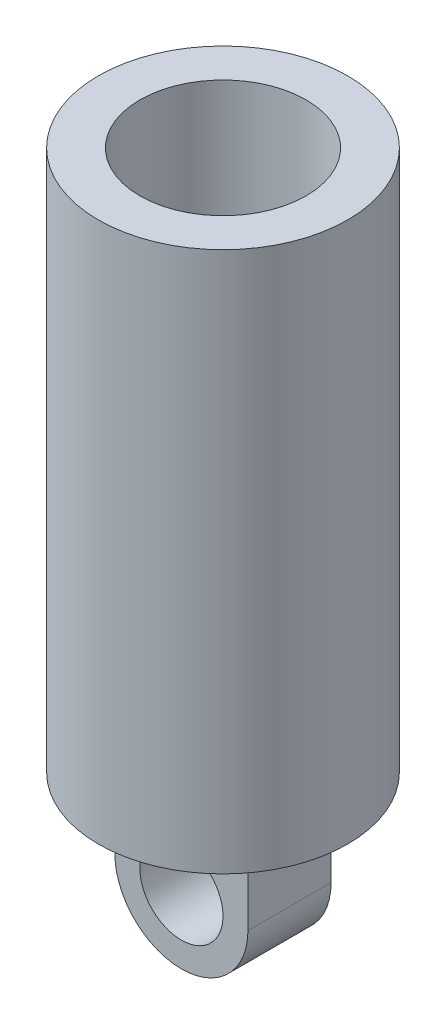
ISO-10303-21;
HEADER;
FILE_DESCRIPTION(('STEP AP214'),'2;1');
FILE_NAME('part.step','',(''),(''),'','','');
FILE_SCHEMA(('AUTOMOTIVE_DESIGN { 1 0 10303 214 1 1 1 1 }'));
ENDSEC;
DATA;
#1=APPLICATION_CONTEXT('core data for automotive mechanical design processes');
#2=APPLICATION_PROTOCOL_DEFINITION('international standard','automotive_design',2000,#1);
#3=PRODUCT_CONTEXT('',#1,'mechanical');
#4=PRODUCT('Part','Part','',(#3));
#5=PRODUCT_RELATED_PRODUCT_CATEGORY('part','',(#4));
#6=PRODUCT_DEFINITION_FORMATION('','',#4);
#7=PRODUCT_DEFINITION_CONTEXT('part definition',#1,'design');
#8=PRODUCT_DEFINITION('design','',#6,#7);
#9=PRODUCT_DEFINITION_SHAPE('','',#8);
#10=(LENGTH_UNIT() NAMED_UNIT(*) SI_UNIT(.MILLI.,.METRE.));
#11=(NAMED_UNIT(*) PLANE_ANGLE_UNIT() SI_UNIT($,.RADIAN.));
#12=(NAMED_UNIT(*) SI_UNIT($,.STERADIAN.) SOLID_ANGLE_UNIT());
#13=UNCERTAINTY_MEASURE_WITH_UNIT(LENGTH_MEASURE(1.E-05),#10,'distance_accuracy_value','');
#14=(GEOMETRIC_REPRESENTATION_CONTEXT(3) GLOBAL_UNCERTAINTY_ASSIGNED_CONTEXT((#13)) GLOBAL_UNIT_ASSIGNED_CONTEXT((#10,
#11,#12)) REPRESENTATION_CONTEXT('',''));
#15=CARTESIAN_POINT('',(0.,0.,0.));
#16=DIRECTION('',(0.,0.,1.));
#17=DIRECTION('',(1.,0.,0.));
#18=AXIS2_PLACEMENT_3D('',#15,#16,#17);
#19=CARTESIAN_POINT('',(-4.,0.,2.5));
#20=DIRECTION('',(-1.,0.,0.));
#21=DIRECTION('',(0.,0.,1.));
#22=AXIS2_PLACEMENT_3D('',#19,#20,#21);
#23=PLANE('',#22);
#24=DIRECTION('',(0.,1.,0.));
#25=VECTOR('',#24,1.);
#26=CARTESIAN_POINT('',(-4.,0.,-2.5));
#27=LINE('',#26,#25);
#28=CARTESIAN_POINT('',(-4.,0.,-2.5));
#29=VERTEX_POINT('',#28);
#30=CARTESIAN_POINT('',(-4.,5.,-2.5));
#31=VERTEX_POINT('',#30);
#32=EDGE_CURVE('E82',#29,#31,#27,.T.);
#33=ORIENTED_EDGE('',*,*,#32,.F.);
#34=DIRECTION('',(0.,0.,-1.));
#35=VECTOR('',#34,1.);
#36=CARTESIAN_POINT('',(-4.,0.,2.5));
#37=LINE('',#36,#35);
#38=CARTESIAN_POINT('',(-4.,0.,2.5));
#39=VERTEX_POINT('',#38);
#40=EDGE_CURVE('E44',#39,#29,#37,.T.);
#41=ORIENTED_EDGE('',*,*,#40,.F.);
#42=DIRECTION('',(0.,1.,0.));
#43=VECTOR('',#42,1.);
#44=CARTESIAN_POINT('',(-4.,0.,2.5));
#45=LINE('',#44,#43);
#46=CARTESIAN_POINT('',(-4.,5.,2.5));
#47=VERTEX_POINT('',#46);
#48=EDGE_CURVE('E52',#39,#47,#45,.T.);
#49=ORIENTED_EDGE('',*,*,#48,.T.);
#50=DIRECTION('',(0.,0.,-1.));
#51=VECTOR('',#50,1.);
#52=CARTESIAN_POINT('',(-4.,5.,2.5));
#53=LINE('',#52,#51);
#54=EDGE_CURVE('E73',#47,#31,#53,.T.);
#55=ORIENTED_EDGE('',*,*,#54,.T.);
#56=EDGE_LOOP('',(#33,#41,#49,#55));
#57=FACE_BOUND('',#56,.T.);
#58=ADVANCED_FACE('F35',(#57),#23,.T.);
#59=CARTESIAN_POINT('',(0.,0.,2.5));
#60=DIRECTION('',(0.,0.,-1.));
#61=DIRECTION('',(-1.,0.,0.));
#62=AXIS2_PLACEMENT_3D('',#59,#60,#61);
#63=CYLINDRICAL_SURFACE('',#62,4.);
#64=CARTESIAN_POINT('',(0.,0.,-2.5));
#65=DIRECTION('',(0.,0.,1.));
#66=DIRECTION('',(1.,0.,0.));
#67=AXIS2_PLACEMENT_3D('',#64,#65,#66);
#68=CIRCLE('',#67,4.);
#69=CARTESIAN_POINT('',(4.,0.,-2.5));
#70=VERTEX_POINT('',#69);
#71=EDGE_CURVE('E95',#29,#70,#68,.T.);
#72=ORIENTED_EDGE('',*,*,#71,.T.);
#73=DIRECTION('',(0.,0.,-1.));
#74=VECTOR('',#73,1.);
#75=CARTESIAN_POINT('',(4.,0.,2.5));
#76=LINE('',#75,#74);
#77=CARTESIAN_POINT('',(4.,0.,2.5));
#78=VERTEX_POINT('',#77);
#79=EDGE_CURVE('E93',#78,#70,#76,.T.);
#80=ORIENTED_EDGE('',*,*,#79,.F.);
#81=CARTESIAN_POINT('',(0.,0.,2.5));
#82=DIRECTION('',(0.,0.,1.));
#83=DIRECTION('',(1.,0.,0.));
#84=AXIS2_PLACEMENT_3D('',#81,#82,#83);
#85=CIRCLE('',#84,4.);
#86=EDGE_CURVE('E106',#39,#78,#85,.T.);
#87=ORIENTED_EDGE('',*,*,#86,.F.);
#88=ORIENTED_EDGE('',*,*,#40,.T.);
#89=EDGE_LOOP('',(#72,#80,#87,#88));
#90=FACE_BOUND('',#89,.T.);
#91=ADVANCED_FACE('F104',(#90),#63,.T.);
#92=CARTESIAN_POINT('',(4.,0.,2.5));
#93=DIRECTION('',(-1.,0.,0.));
#94=DIRECTION('',(0.,0.,1.));
#95=AXIS2_PLACEMENT_3D('',#92,#93,#94);
#96=PLANE('',#95);
#97=DIRECTION('',(0.,1.,0.));
#98=VECTOR('',#97,1.);
#99=CARTESIAN_POINT('',(4.,0.,-2.5));
#100=LINE('',#99,#98);
#101=CARTESIAN_POINT('',(4.,5.,-2.5));
#102=VERTEX_POINT('',#101);
#103=EDGE_CURVE('E68',#70,#102,#100,.T.);
#104=ORIENTED_EDGE('',*,*,#103,.T.);
#105=DIRECTION('',(0.,0.,-1.));
#106=VECTOR('',#105,1.);
#107=CARTESIAN_POINT('',(4.,5.,2.5));
#108=LINE('',#107,#106);
#109=CARTESIAN_POINT('',(4.,5.,2.5));
#110=VERTEX_POINT('',#109);
#111=EDGE_CURVE('E90',#110,#102,#108,.T.);
#112=ORIENTED_EDGE('',*,*,#111,.F.);
#113=DIRECTION('',(0.,1.,0.));
#114=VECTOR('',#113,1.);
#115=CARTESIAN_POINT('',(4.,0.,2.5));
#116=LINE('',#115,#114);
#117=EDGE_CURVE('E115',#78,#110,#116,.T.);
#118=ORIENTED_EDGE('',*,*,#117,.F.);
#119=ORIENTED_EDGE('',*,*,#79,.T.);
#120=EDGE_LOOP('',(#104,#112,#118,#119));
#121=FACE_BOUND('',#120,.T.);
#122=ADVANCED_FACE('F89',(#121),#96,.F.);
#123=CARTESIAN_POINT('',(0.,0.,2.5));
#124=DIRECTION('',(0.,0.,-1.));
#125=DIRECTION('',(-1.,0.,0.));
#126=AXIS2_PLACEMENT_3D('',#123,#124,#125);
#127=CYLINDRICAL_SURFACE('',#126,2.5);
#128=CARTESIAN_POINT('',(0.,0.,2.5));
#129=DIRECTION('',(0.,0.,1.));
#130=DIRECTION('',(1.,0.,0.));
#131=AXIS2_PLACEMENT_3D('',#128,#129,#130);
#132=CIRCLE('',#131,2.5);
#133=CARTESIAN_POINT('',(2.5,0.,2.5));
#134=VERTEX_POINT('',#133);
#135=EDGE_CURVE('E85',#134,#134,#132,.T.);
#136=ORIENTED_EDGE('',*,*,#135,.T.);
#137=EDGE_LOOP('',(#136));
#138=FACE_BOUND('',#137,.T.);
#139=CARTESIAN_POINT('',(0.,0.,-2.5));
#140=DIRECTION('',(0.,0.,1.));
#141=DIRECTION('',(1.,0.,0.));
#142=AXIS2_PLACEMENT_3D('',#139,#140,#141);
#143=CIRCLE('',#142,2.5);
#144=CARTESIAN_POINT('',(2.5,0.,-2.5));
#145=VERTEX_POINT('',#144);
#146=EDGE_CURVE('E108',#145,#145,#143,.T.);
#147=ORIENTED_EDGE('',*,*,#146,.F.);
#148=EDGE_LOOP('',(#147));
#149=FACE_BOUND('',#148,.T.);
#150=ADVANCED_FACE('F37',(#138,#149),#127,.F.);
#151=CARTESIAN_POINT('',(0.,0.,2.5));
#152=DIRECTION('',(0.,0.,1.));
#153=DIRECTION('',(1.,0.,0.));
#154=AXIS2_PLACEMENT_3D('',#151,#152,#153);
#155=PLANE('',#154);
#156=ORIENTED_EDGE('',*,*,#135,.F.);
#157=EDGE_LOOP('',(#156));
#158=FACE_BOUND('',#157,.T.);
#159=ORIENTED_EDGE('',*,*,#48,.F.);
#160=ORIENTED_EDGE('',*,*,#86,.T.);
#161=ORIENTED_EDGE('',*,*,#117,.T.);
#162=DIRECTION('',(1.,0.,0.));
#163=VECTOR('',#162,1.);
#164=CARTESIAN_POINT('',(0.,5.,2.5));
#165=LINE('',#164,#163);
#166=EDGE_CURVE('E99',#47,#110,#165,.T.);
#167=ORIENTED_EDGE('',*,*,#166,.F.);
#168=EDGE_LOOP('',(#159,#160,#161,#167));
#169=FACE_BOUND('',#168,.T.);
#170=ADVANCED_FACE('F156',(#158,#169),#155,.T.);
#171=CARTESIAN_POINT('',(0.,0.,-2.5));
#172=DIRECTION('',(0.,0.,1.));
#173=DIRECTION('',(1.,0.,0.));
#174=AXIS2_PLACEMENT_3D('',#171,#172,#173);
#175=PLANE('',#174);
#176=ORIENTED_EDGE('',*,*,#146,.T.);
#177=EDGE_LOOP('',(#176));
#178=FACE_BOUND('',#177,.T.);
#179=ORIENTED_EDGE('',*,*,#32,.T.);
#180=DIRECTION('',(1.,0.,0.));
#181=VECTOR('',#180,1.);
#182=CARTESIAN_POINT('',(0.,5.,-2.5));
#183=LINE('',#182,#181);
#184=EDGE_CURVE('E80',#31,#102,#183,.T.);
#185=ORIENTED_EDGE('',*,*,#184,.T.);
#186=ORIENTED_EDGE('',*,*,#103,.F.);
#187=ORIENTED_EDGE('',*,*,#71,.F.);
#188=EDGE_LOOP('',(#179,#185,#186,#187));
#189=FACE_BOUND('',#188,.T.);
#190=ADVANCED_FACE('F81',(#178,#189),#175,.F.);
#191=CARTESIAN_POINT('',(0.,7.5,0.));
#192=DIRECTION('',(0.,-1.,0.));
#193=DIRECTION('',(0.,0.,-1.));
#194=AXIS2_PLACEMENT_3D('',#191,#192,#193);
#195=CYLINDRICAL_SURFACE('',#194,7.5);
#196=CARTESIAN_POINT('',(0.,5.,0.));
#197=DIRECTION('',(0.,1.,0.));
#198=DIRECTION('',(0.,0.,1.));
#199=AXIS2_PLACEMENT_3D('',#196,#197,#198);
#200=CIRCLE('',#199,7.5);
#201=CARTESIAN_POINT('',(0.,5.,7.5));
#202=VERTEX_POINT('',#201);
#203=EDGE_CURVE('E111',#202,#202,#200,.T.);
#204=ORIENTED_EDGE('',*,*,#203,.T.);
#205=EDGE_LOOP('',(#204));
#206=FACE_BOUND('',#205,.T.);
#207=CARTESIAN_POINT('',(0.,37.5,0.));
#208=DIRECTION('',(0.,1.,0.));
#209=DIRECTION('',(0.,0.,1.));
#210=AXIS2_PLACEMENT_3D('',#207,#208,#209);
#211=CIRCLE('',#210,7.5);
#212=CARTESIAN_POINT('',(0.,37.5,7.5));
#213=VERTEX_POINT('',#212);
#214=EDGE_CURVE('E123',#213,#213,#211,.T.);
#215=ORIENTED_EDGE('',*,*,#214,.F.);
#216=EDGE_LOOP('',(#215));
#217=FACE_BOUND('',#216,.T.);
#218=ADVANCED_FACE('F143',(#206,#217),#195,.T.);
#219=CARTESIAN_POINT('',(0.,5.,0.));
#220=DIRECTION('',(0.,1.,0.));
#221=DIRECTION('',(0.,0.,1.));
#222=AXIS2_PLACEMENT_3D('',#219,#220,#221);
#223=PLANE('',#222);
#224=ORIENTED_EDGE('',*,*,#184,.F.);
#225=ORIENTED_EDGE('',*,*,#54,.F.);
#226=ORIENTED_EDGE('',*,*,#166,.T.);
#227=ORIENTED_EDGE('',*,*,#111,.T.);
#228=EDGE_LOOP('',(#224,#225,#226,#227));
#229=FACE_BOUND('',#228,.T.);
#230=ORIENTED_EDGE('',*,*,#203,.F.);
#231=EDGE_LOOP('',(#230));
#232=FACE_BOUND('',#231,.T.);
#233=ADVANCED_FACE('F97',(#229,#232),#223,.F.);
#234=CARTESIAN_POINT('',(0.,37.5,0.));
#235=DIRECTION('',(0.,1.,0.));
#236=DIRECTION('',(0.,0.,1.));
#237=AXIS2_PLACEMENT_3D('',#234,#235,#236);
#238=PLANE('',#237);
#239=ORIENTED_EDGE('',*,*,#214,.T.);
#240=EDGE_LOOP('',(#239));
#241=FACE_BOUND('',#240,.T.);
#242=CARTESIAN_POINT('',(0.,37.5,0.));
#243=DIRECTION('',(0.,1.,0.));
#244=DIRECTION('',(0.,0.,1.));
#245=AXIS2_PLACEMENT_3D('',#242,#243,#244);
#246=CIRCLE('',#245,5.);
#247=CARTESIAN_POINT('',(0.,37.5,5.));
#248=VERTEX_POINT('',#247);
#249=EDGE_CURVE('E126',#248,#248,#246,.T.);
#250=ORIENTED_EDGE('',*,*,#249,.F.);
#251=EDGE_LOOP('',(#250));
#252=FACE_BOUND('',#251,.T.);
#253=ADVANCED_FACE('F133',(#241,#252),#238,.T.);
#254=CARTESIAN_POINT('',(0.,37.5,0.));
#255=DIRECTION('',(0.,-1.,0.));
#256=DIRECTION('',(0.,0.,-1.));
#257=AXIS2_PLACEMENT_3D('',#254,#255,#256);
#258=CYLINDRICAL_SURFACE('',#257,5.);
#259=ORIENTED_EDGE('',*,*,#249,.T.);
#260=EDGE_LOOP('',(#259));
#261=FACE_BOUND('',#260,.T.);
#262=CARTESIAN_POINT('',(0.,7.5,0.));
#263=DIRECTION('',(0.,1.,0.));
#264=DIRECTION('',(0.,0.,1.));
#265=AXIS2_PLACEMENT_3D('',#262,#263,#264);
#266=CIRCLE('',#265,5.);
#267=CARTESIAN_POINT('',(0.,7.5,5.));
#268=VERTEX_POINT('',#267);
#269=EDGE_CURVE('E11',#268,#268,#266,.F.);
#270=ORIENTED_EDGE('',*,*,#269,.T.);
#271=EDGE_LOOP('',(#270));
#272=FACE_BOUND('',#271,.T.);
#273=ADVANCED_FACE('F130',(#261,#272),#258,.F.);
#274=CARTESIAN_POINT('',(0.,7.5,0.));
#275=DIRECTION('',(0.,1.,0.));
#276=DIRECTION('',(0.,0.,1.));
#277=AXIS2_PLACEMENT_3D('',#274,#275,#276);
#278=PLANE('',#277);
#279=ORIENTED_EDGE('',*,*,#269,.F.);
#280=EDGE_LOOP('',(#279));
#281=FACE_BOUND('',#280,.T.);
#282=ADVANCED_FACE('F141',(#281),#278,.T.);
#283=CLOSED_SHELL('',(#58,#91,#122,#150,#170,#190,#218,#233,#253,#273,#282));
#284=MANIFOLD_SOLID_BREP('B2',#283);
#285=ADVANCED_BREP_SHAPE_REPRESENTATION('',(#18,#284),#14);
#286=SHAPE_DEFINITION_REPRESENTATION(#9,#285);
ENDSEC;
END-ISO-10303-21;
